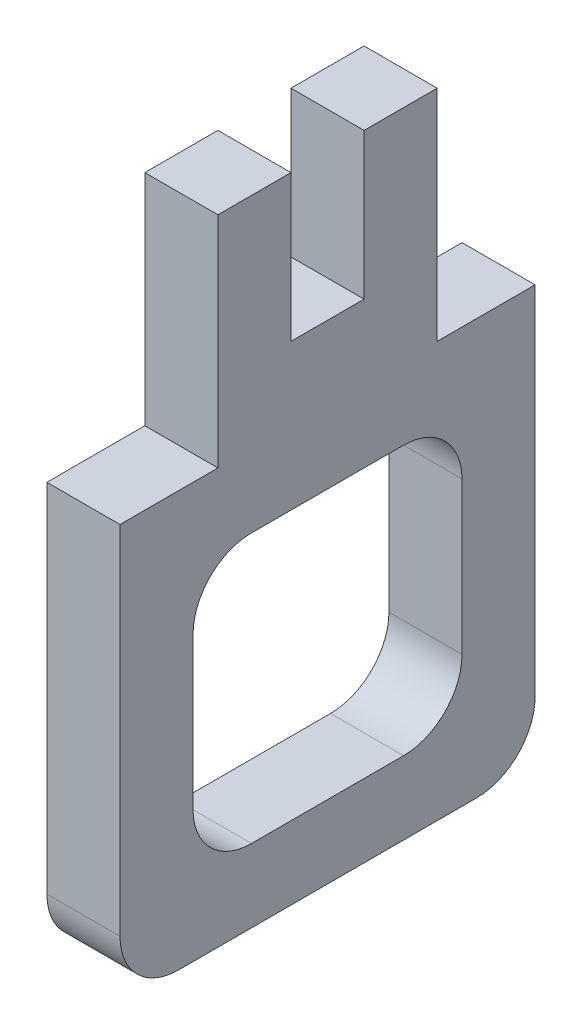
ISO-10303-21;
HEADER;
FILE_DESCRIPTION(('STEP AP214'),'2;1');
FILE_NAME('part.step','',(''),(''),'','','');
FILE_SCHEMA(('AUTOMOTIVE_DESIGN { 1 0 10303 214 1 1 1 1 }'));
ENDSEC;
DATA;
#1=APPLICATION_CONTEXT('core data for automotive mechanical design processes');
#2=APPLICATION_PROTOCOL_DEFINITION('international standard','automotive_design',2000,#1);
#3=PRODUCT_CONTEXT('',#1,'mechanical');
#4=PRODUCT('Part','Part','',(#3));
#5=PRODUCT_RELATED_PRODUCT_CATEGORY('part','',(#4));
#6=PRODUCT_DEFINITION_FORMATION('','',#4);
#7=PRODUCT_DEFINITION_CONTEXT('part definition',#1,'design');
#8=PRODUCT_DEFINITION('design','',#6,#7);
#9=PRODUCT_DEFINITION_SHAPE('','',#8);
#10=(LENGTH_UNIT() NAMED_UNIT(*) SI_UNIT(.MILLI.,.METRE.));
#11=(NAMED_UNIT(*) PLANE_ANGLE_UNIT() SI_UNIT($,.RADIAN.));
#12=(NAMED_UNIT(*) SI_UNIT($,.STERADIAN.) SOLID_ANGLE_UNIT());
#13=UNCERTAINTY_MEASURE_WITH_UNIT(LENGTH_MEASURE(1.E-05),#10,'distance_accuracy_value','');
#14=(GEOMETRIC_REPRESENTATION_CONTEXT(3) GLOBAL_UNCERTAINTY_ASSIGNED_CONTEXT((#13)) GLOBAL_UNIT_ASSIGNED_CONTEXT((#10,
#11,#12)) REPRESENTATION_CONTEXT('',''));
#15=CARTESIAN_POINT('',(0.,0.,0.));
#16=DIRECTION('',(0.,0.,1.));
#17=DIRECTION('',(1.,0.,0.));
#18=AXIS2_PLACEMENT_3D('',#15,#16,#17);
#19=CARTESIAN_POINT('',(6.35,5.08,-5.08));
#20=DIRECTION('',(1.,0.,0.));
#21=DIRECTION('',(0.,0.,-1.));
#22=AXIS2_PLACEMENT_3D('',#19,#20,#21);
#23=PLANE('',#22);
#24=DIRECTION('',(0.,0.,1.));
#25=VECTOR('',#24,1.);
#26=CARTESIAN_POINT('',(6.35,55.118,-14.859));
#27=LINE('',#26,#25);
#28=CARTESIAN_POINT('',(6.35,55.118,-14.859));
#29=VERTEX_POINT('',#28);
#30=CARTESIAN_POINT('',(6.35,55.118,-8.509));
#31=VERTEX_POINT('',#30);
#32=EDGE_CURVE('E252',#29,#31,#27,.T.);
#33=ORIENTED_EDGE('',*,*,#32,.T.);
#34=DIRECTION('',(0.,-1.,0.));
#35=VECTOR('',#34,1.);
#36=CARTESIAN_POINT('',(6.35,55.118,-8.509));
#37=LINE('',#36,#35);
#38=CARTESIAN_POINT('',(6.35,36.068,-8.509));
#39=VERTEX_POINT('',#38);
#40=EDGE_CURVE('E255',#31,#39,#37,.T.);
#41=ORIENTED_EDGE('',*,*,#40,.T.);
#42=DIRECTION('',(0.,0.,1.));
#43=VECTOR('',#42,1.);
#44=CARTESIAN_POINT('',(6.35,36.068,-8.509));
#45=LINE('',#44,#43);
#46=CARTESIAN_POINT('',(6.35,36.068,0.));
#47=VERTEX_POINT('',#46);
#48=EDGE_CURVE('E258',#39,#47,#45,.T.);
#49=ORIENTED_EDGE('',*,*,#48,.T.);
#50=DIRECTION('',(0.,-1.,0.));
#51=VECTOR('',#50,1.);
#52=CARTESIAN_POINT('',(6.35,36.068,0.));
#53=LINE('',#52,#51);
#54=CARTESIAN_POINT('',(6.35,5.08000000000004,0.));
#55=VERTEX_POINT('',#54);
#56=EDGE_CURVE('E260',#47,#55,#53,.T.);
#57=ORIENTED_EDGE('',*,*,#56,.T.);
#58=CARTESIAN_POINT('',(6.35,5.08,-5.08));
#59=DIRECTION('',(1.,0.,0.));
#60=DIRECTION('',(0.,0.,-1.));
#61=AXIS2_PLACEMENT_3D('',#58,#59,#60);
#62=CIRCLE('',#61,5.08);
#63=CARTESIAN_POINT('',(6.35,0.,-5.08000000000004));
#64=VERTEX_POINT('',#63);
#65=EDGE_CURVE('E262',#55,#64,#62,.T.);
#66=ORIENTED_EDGE('',*,*,#65,.T.);
#67=DIRECTION('',(0.,0.,-1.));
#68=VECTOR('',#67,1.);
#69=CARTESIAN_POINT('',(6.35,0.,-30.988));
#70=LINE('',#69,#68);
#71=CARTESIAN_POINT('',(6.35,0.,-30.988));
#72=VERTEX_POINT('',#71);
#73=EDGE_CURVE('E264',#64,#72,#70,.T.);
#74=ORIENTED_EDGE('',*,*,#73,.T.);
#75=CARTESIAN_POINT('',(6.35,5.08,-30.988));
#76=DIRECTION('',(1.,0.,0.));
#77=DIRECTION('',(0.,0.,1.));
#78=AXIS2_PLACEMENT_3D('',#75,#76,#77);
#79=CIRCLE('',#78,5.08);
#80=CARTESIAN_POINT('',(6.35,5.08000000000004,-36.068));
#81=VERTEX_POINT('',#80);
#82=EDGE_CURVE('E266',#72,#81,#79,.T.);
#83=ORIENTED_EDGE('',*,*,#82,.T.);
#84=DIRECTION('',(0.,1.,0.));
#85=VECTOR('',#84,1.);
#86=CARTESIAN_POINT('',(6.35,36.068,-36.068));
#87=LINE('',#86,#85);
#88=CARTESIAN_POINT('',(6.35,36.068,-36.068));
#89=VERTEX_POINT('',#88);
#90=EDGE_CURVE('E268',#81,#89,#87,.T.);
#91=ORIENTED_EDGE('',*,*,#90,.T.);
#92=DIRECTION('',(0.,0.,1.));
#93=VECTOR('',#92,1.);
#94=CARTESIAN_POINT('',(6.35,36.068,-27.559));
#95=LINE('',#94,#93);
#96=CARTESIAN_POINT('',(6.35,36.068,-27.559));
#97=VERTEX_POINT('',#96);
#98=EDGE_CURVE('E270',#89,#97,#95,.T.);
#99=ORIENTED_EDGE('',*,*,#98,.T.);
#100=DIRECTION('',(0.,1.,0.));
#101=VECTOR('',#100,1.);
#102=CARTESIAN_POINT('',(6.35,55.118,-27.559));
#103=LINE('',#102,#101);
#104=CARTESIAN_POINT('',(6.35,55.118,-27.559));
#105=VERTEX_POINT('',#104);
#106=EDGE_CURVE('E272',#97,#105,#103,.T.);
#107=ORIENTED_EDGE('',*,*,#106,.T.);
#108=DIRECTION('',(0.,0.,1.));
#109=VECTOR('',#108,1.);
#110=CARTESIAN_POINT('',(6.35,55.118,-21.209));
#111=LINE('',#110,#109);
#112=CARTESIAN_POINT('',(6.35,55.118,-21.209));
#113=VERTEX_POINT('',#112);
#114=EDGE_CURVE('E274',#105,#113,#111,.T.);
#115=ORIENTED_EDGE('',*,*,#114,.T.);
#116=DIRECTION('',(0.,-1.,0.));
#117=VECTOR('',#116,1.);
#118=CARTESIAN_POINT('',(6.35,42.418,-21.209));
#119=LINE('',#118,#117);
#120=CARTESIAN_POINT('',(6.35,42.418,-21.209));
#121=VERTEX_POINT('',#120);
#122=EDGE_CURVE('E276',#113,#121,#119,.T.);
#123=ORIENTED_EDGE('',*,*,#122,.T.);
#124=DIRECTION('',(0.,0.,1.));
#125=VECTOR('',#124,1.);
#126=CARTESIAN_POINT('',(6.35,42.418,-14.859));
#127=LINE('',#126,#125);
#128=CARTESIAN_POINT('',(6.35,42.418,-14.859));
#129=VERTEX_POINT('',#128);
#130=EDGE_CURVE('E278',#121,#129,#127,.T.);
#131=ORIENTED_EDGE('',*,*,#130,.T.);
#132=DIRECTION('',(0.,1.,0.));
#133=VECTOR('',#132,1.);
#134=CARTESIAN_POINT('',(6.35,55.118,-14.859));
#135=LINE('',#134,#133);
#136=EDGE_CURVE('E280',#129,#29,#135,.T.);
#137=ORIENTED_EDGE('',*,*,#136,.T.);
#138=EDGE_LOOP('',(#33,#41,#49,#57,#66,#74,#83,#91,#99,#107,#115,#123,#131,#137));
#139=FACE_BOUND('',#138,.T.);
#140=DIRECTION('',(0.,0.,-1.));
#141=VECTOR('',#140,1.);
#142=CARTESIAN_POINT('',(6.35,6.35,-11.43));
#143=LINE('',#142,#141);
#144=CARTESIAN_POINT('',(6.35,6.35,-11.43));
#145=VERTEX_POINT('',#144);
#146=CARTESIAN_POINT('',(6.35,6.35,-24.638));
#147=VERTEX_POINT('',#146);
#148=EDGE_CURVE('E195',#145,#147,#143,.T.);
#149=ORIENTED_EDGE('',*,*,#148,.F.);
#150=CARTESIAN_POINT('',(6.35,11.43,-11.43));
#151=DIRECTION('',(1.,0.,0.));
#152=DIRECTION('',(0.,0.,1.));
#153=AXIS2_PLACEMENT_3D('',#150,#151,#152);
#154=CIRCLE('',#153,5.08);
#155=CARTESIAN_POINT('',(6.35,11.43,-6.35));
#156=VERTEX_POINT('',#155);
#157=EDGE_CURVE('E187',#156,#145,#154,.T.);
#158=ORIENTED_EDGE('',*,*,#157,.F.);
#159=DIRECTION('',(0.,-1.,0.));
#160=VECTOR('',#159,1.);
#161=CARTESIAN_POINT('',(6.35,11.43,-6.35));
#162=LINE('',#161,#160);
#163=CARTESIAN_POINT('',(6.35,24.638,-6.35));
#164=VERTEX_POINT('',#163);
#165=EDGE_CURVE('E220',#164,#156,#162,.T.);
#166=ORIENTED_EDGE('',*,*,#165,.F.);
#167=CARTESIAN_POINT('',(6.35,24.638,-11.43));
#168=DIRECTION('',(1.,0.,0.));
#169=DIRECTION('',(0.,0.,1.));
#170=AXIS2_PLACEMENT_3D('',#167,#168,#169);
#171=CIRCLE('',#170,5.08);
#172=CARTESIAN_POINT('',(6.35,29.718,-11.43));
#173=VERTEX_POINT('',#172);
#174=EDGE_CURVE('E218',#173,#164,#171,.T.);
#175=ORIENTED_EDGE('',*,*,#174,.F.);
#176=DIRECTION('',(0.,0.,1.));
#177=VECTOR('',#176,1.);
#178=CARTESIAN_POINT('',(6.35,29.718,-11.43));
#179=LINE('',#178,#177);
#180=CARTESIAN_POINT('',(6.35,29.718,-24.638));
#181=VERTEX_POINT('',#180);
#182=EDGE_CURVE('E216',#181,#173,#179,.T.);
#183=ORIENTED_EDGE('',*,*,#182,.F.);
#184=CARTESIAN_POINT('',(6.35,24.638,-24.638));
#185=DIRECTION('',(1.,0.,0.));
#186=DIRECTION('',(0.,0.,1.));
#187=AXIS2_PLACEMENT_3D('',#184,#185,#186);
#188=CIRCLE('',#187,5.08);
#189=CARTESIAN_POINT('',(6.35,24.638,-29.718));
#190=VERTEX_POINT('',#189);
#191=EDGE_CURVE('E214',#190,#181,#188,.T.);
#192=ORIENTED_EDGE('',*,*,#191,.F.);
#193=DIRECTION('',(0.,1.,0.));
#194=VECTOR('',#193,1.);
#195=CARTESIAN_POINT('',(6.35,11.43,-29.718));
#196=LINE('',#195,#194);
#197=CARTESIAN_POINT('',(6.35,11.43,-29.718));
#198=VERTEX_POINT('',#197);
#199=EDGE_CURVE('E210',#198,#190,#196,.T.);
#200=ORIENTED_EDGE('',*,*,#199,.F.);
#201=CARTESIAN_POINT('',(6.35,11.43,-24.638));
#202=DIRECTION('',(1.,0.,0.));
#203=DIRECTION('',(0.,0.,-1.));
#204=AXIS2_PLACEMENT_3D('',#201,#202,#203);
#205=CIRCLE('',#204,5.08);
#206=EDGE_CURVE('E208',#147,#198,#205,.T.);
#207=ORIENTED_EDGE('',*,*,#206,.F.);
#208=EDGE_LOOP('',(#149,#158,#166,#175,#183,#192,#200,#207));
#209=FACE_BOUND('',#208,.T.);
#210=ADVANCED_FACE('F38',(#139,#209),#23,.T.);
#211=CARTESIAN_POINT('',(0.,5.08,-5.08));
#212=DIRECTION('',(1.,0.,0.));
#213=DIRECTION('',(0.,0.,-1.));
#214=AXIS2_PLACEMENT_3D('',#211,#212,#213);
#215=PLANE('',#214);
#216=DIRECTION('',(0.,0.,1.));
#217=VECTOR('',#216,1.);
#218=CARTESIAN_POINT('',(0.,55.118,-14.859));
#219=LINE('',#218,#217);
#220=CARTESIAN_POINT('',(0.,55.118,-14.859));
#221=VERTEX_POINT('',#220);
#222=CARTESIAN_POINT('',(0.,55.118,-8.509));
#223=VERTEX_POINT('',#222);
#224=EDGE_CURVE('E203',#221,#223,#219,.T.);
#225=ORIENTED_EDGE('',*,*,#224,.F.);
#226=DIRECTION('',(0.,1.,0.));
#227=VECTOR('',#226,1.);
#228=CARTESIAN_POINT('',(0.,55.118,-14.859));
#229=LINE('',#228,#227);
#230=CARTESIAN_POINT('',(0.,42.418,-14.859));
#231=VERTEX_POINT('',#230);
#232=EDGE_CURVE('E256',#231,#221,#229,.T.);
#233=ORIENTED_EDGE('',*,*,#232,.F.);
#234=DIRECTION('',(0.,0.,1.));
#235=VECTOR('',#234,1.);
#236=CARTESIAN_POINT('',(0.,42.418,-14.859));
#237=LINE('',#236,#235);
#238=CARTESIAN_POINT('',(0.,42.418,-21.209));
#239=VERTEX_POINT('',#238);
#240=EDGE_CURVE('E307',#239,#231,#237,.T.);
#241=ORIENTED_EDGE('',*,*,#240,.F.);
#242=DIRECTION('',(0.,-1.,0.));
#243=VECTOR('',#242,1.);
#244=CARTESIAN_POINT('',(0.,42.418,-21.209));
#245=LINE('',#244,#243);
#246=CARTESIAN_POINT('',(0.,55.118,-21.209));
#247=VERTEX_POINT('',#246);
#248=EDGE_CURVE('E305',#247,#239,#245,.T.);
#249=ORIENTED_EDGE('',*,*,#248,.F.);
#250=DIRECTION('',(0.,0.,1.));
#251=VECTOR('',#250,1.);
#252=CARTESIAN_POINT('',(0.,55.118,-21.209));
#253=LINE('',#252,#251);
#254=CARTESIAN_POINT('',(0.,55.118,-27.559));
#255=VERTEX_POINT('',#254);
#256=EDGE_CURVE('E303',#255,#247,#253,.T.);
#257=ORIENTED_EDGE('',*,*,#256,.F.);
#258=DIRECTION('',(0.,1.,0.));
#259=VECTOR('',#258,1.);
#260=CARTESIAN_POINT('',(0.,55.118,-27.559));
#261=LINE('',#260,#259);
#262=CARTESIAN_POINT('',(0.,36.068,-27.559));
#263=VERTEX_POINT('',#262);
#264=EDGE_CURVE('E301',#263,#255,#261,.T.);
#265=ORIENTED_EDGE('',*,*,#264,.F.);
#266=DIRECTION('',(0.,0.,1.));
#267=VECTOR('',#266,1.);
#268=CARTESIAN_POINT('',(0.,36.068,-27.559));
#269=LINE('',#268,#267);
#270=CARTESIAN_POINT('',(0.,36.068,-36.068));
#271=VERTEX_POINT('',#270);
#272=EDGE_CURVE('E299',#271,#263,#269,.T.);
#273=ORIENTED_EDGE('',*,*,#272,.F.);
#274=DIRECTION('',(0.,1.,0.));
#275=VECTOR('',#274,1.);
#276=CARTESIAN_POINT('',(0.,36.068,-36.068));
#277=LINE('',#276,#275);
#278=CARTESIAN_POINT('',(0.,5.08000000000004,-36.068));
#279=VERTEX_POINT('',#278);
#280=EDGE_CURVE('E297',#279,#271,#277,.T.);
#281=ORIENTED_EDGE('',*,*,#280,.F.);
#282=CARTESIAN_POINT('',(0.,5.08,-30.988));
#283=DIRECTION('',(1.,0.,0.));
#284=DIRECTION('',(0.,0.,1.));
#285=AXIS2_PLACEMENT_3D('',#282,#283,#284);
#286=CIRCLE('',#285,5.08);
#287=CARTESIAN_POINT('',(0.,0.,-30.988));
#288=VERTEX_POINT('',#287);
#289=EDGE_CURVE('E295',#288,#279,#286,.T.);
#290=ORIENTED_EDGE('',*,*,#289,.F.);
#291=DIRECTION('',(0.,0.,-1.));
#292=VECTOR('',#291,1.);
#293=CARTESIAN_POINT('',(0.,0.,-30.988));
#294=LINE('',#293,#292);
#295=CARTESIAN_POINT('',(0.,0.,-5.08000000000004));
#296=VERTEX_POINT('',#295);
#297=EDGE_CURVE('E293',#296,#288,#294,.T.);
#298=ORIENTED_EDGE('',*,*,#297,.F.);
#299=CARTESIAN_POINT('',(0.,5.08,-5.08));
#300=DIRECTION('',(1.,0.,0.));
#301=DIRECTION('',(0.,0.,-1.));
#302=AXIS2_PLACEMENT_3D('',#299,#300,#301);
#303=CIRCLE('',#302,5.08);
#304=CARTESIAN_POINT('',(0.,5.08000000000004,0.));
#305=VERTEX_POINT('',#304);
#306=EDGE_CURVE('E291',#305,#296,#303,.T.);
#307=ORIENTED_EDGE('',*,*,#306,.F.);
#308=DIRECTION('',(0.,-1.,0.));
#309=VECTOR('',#308,1.);
#310=CARTESIAN_POINT('',(0.,36.068,0.));
#311=LINE('',#310,#309);
#312=CARTESIAN_POINT('',(0.,36.068,0.));
#313=VERTEX_POINT('',#312);
#314=EDGE_CURVE('E289',#313,#305,#311,.T.);
#315=ORIENTED_EDGE('',*,*,#314,.F.);
#316=DIRECTION('',(0.,0.,1.));
#317=VECTOR('',#316,1.);
#318=CARTESIAN_POINT('',(0.,36.068,-8.509));
#319=LINE('',#318,#317);
#320=CARTESIAN_POINT('',(0.,36.068,-8.509));
#321=VERTEX_POINT('',#320);
#322=EDGE_CURVE('E287',#321,#313,#319,.T.);
#323=ORIENTED_EDGE('',*,*,#322,.F.);
#324=DIRECTION('',(0.,-1.,0.));
#325=VECTOR('',#324,1.);
#326=CARTESIAN_POINT('',(0.,55.118,-8.509));
#327=LINE('',#326,#325);
#328=EDGE_CURVE('E285',#223,#321,#327,.T.);
#329=ORIENTED_EDGE('',*,*,#328,.F.);
#330=EDGE_LOOP('',(#225,#233,#241,#249,#257,#265,#273,#281,#290,#298,#307,#315,#323,#329));
#331=FACE_BOUND('',#330,.T.);
#332=CARTESIAN_POINT('',(0.,11.43,-11.43));
#333=DIRECTION('',(1.,0.,0.));
#334=DIRECTION('',(0.,0.,1.));
#335=AXIS2_PLACEMENT_3D('',#332,#333,#334);
#336=CIRCLE('',#335,5.08);
#337=CARTESIAN_POINT('',(0.,11.43,-6.35));
#338=VERTEX_POINT('',#337);
#339=CARTESIAN_POINT('',(0.,6.35,-11.43));
#340=VERTEX_POINT('',#339);
#341=EDGE_CURVE('E61',#338,#340,#336,.T.);
#342=ORIENTED_EDGE('',*,*,#341,.T.);
#343=DIRECTION('',(0.,0.,-1.));
#344=VECTOR('',#343,1.);
#345=CARTESIAN_POINT('',(0.,6.35,-11.43));
#346=LINE('',#345,#344);
#347=CARTESIAN_POINT('',(0.,6.35,-24.638));
#348=VERTEX_POINT('',#347);
#349=EDGE_CURVE('E202',#340,#348,#346,.T.);
#350=ORIENTED_EDGE('',*,*,#349,.T.);
#351=CARTESIAN_POINT('',(0.,11.43,-24.638));
#352=DIRECTION('',(1.,0.,0.));
#353=DIRECTION('',(0.,0.,-1.));
#354=AXIS2_PLACEMENT_3D('',#351,#352,#353);
#355=CIRCLE('',#354,5.08);
#356=CARTESIAN_POINT('',(0.,11.43,-29.718));
#357=VERTEX_POINT('',#356);
#358=EDGE_CURVE('E224',#348,#357,#355,.T.);
#359=ORIENTED_EDGE('',*,*,#358,.T.);
#360=DIRECTION('',(0.,1.,0.));
#361=VECTOR('',#360,1.);
#362=CARTESIAN_POINT('',(0.,11.43,-29.718));
#363=LINE('',#362,#361);
#364=CARTESIAN_POINT('',(0.,24.638,-29.718));
#365=VERTEX_POINT('',#364);
#366=EDGE_CURVE('E227',#357,#365,#363,.T.);
#367=ORIENTED_EDGE('',*,*,#366,.T.);
#368=CARTESIAN_POINT('',(0.,24.638,-24.638));
#369=DIRECTION('',(1.,0.,0.));
#370=DIRECTION('',(0.,0.,1.));
#371=AXIS2_PLACEMENT_3D('',#368,#369,#370);
#372=CIRCLE('',#371,5.08);
#373=CARTESIAN_POINT('',(0.,29.718,-24.638));
#374=VERTEX_POINT('',#373);
#375=EDGE_CURVE('E230',#365,#374,#372,.T.);
#376=ORIENTED_EDGE('',*,*,#375,.T.);
#377=DIRECTION('',(0.,0.,1.));
#378=VECTOR('',#377,1.);
#379=CARTESIAN_POINT('',(0.,29.718,-11.43));
#380=LINE('',#379,#378);
#381=CARTESIAN_POINT('',(0.,29.718,-11.43));
#382=VERTEX_POINT('',#381);
#383=EDGE_CURVE('E233',#374,#382,#380,.T.);
#384=ORIENTED_EDGE('',*,*,#383,.T.);
#385=CARTESIAN_POINT('',(0.,24.638,-11.43));
#386=DIRECTION('',(1.,0.,0.));
#387=DIRECTION('',(0.,0.,1.));
#388=AXIS2_PLACEMENT_3D('',#385,#386,#387);
#389=CIRCLE('',#388,5.08);
#390=CARTESIAN_POINT('',(0.,24.638,-6.35));
#391=VERTEX_POINT('',#390);
#392=EDGE_CURVE('E236',#382,#391,#389,.T.);
#393=ORIENTED_EDGE('',*,*,#392,.T.);
#394=DIRECTION('',(0.,-1.,0.));
#395=VECTOR('',#394,1.);
#396=CARTESIAN_POINT('',(0.,11.43,-6.35));
#397=LINE('',#396,#395);
#398=EDGE_CURVE('E196',#391,#338,#397,.T.);
#399=ORIENTED_EDGE('',*,*,#398,.T.);
#400=EDGE_LOOP('',(#342,#350,#359,#367,#376,#384,#393,#399));
#401=FACE_BOUND('',#400,.T.);
#402=ADVANCED_FACE('F355',(#331,#401),#215,.F.);
#403=CARTESIAN_POINT('',(6.35,55.118,-14.859));
#404=DIRECTION('',(0.,-1.,0.));
#405=DIRECTION('',(0.,0.,-1.));
#406=AXIS2_PLACEMENT_3D('',#403,#404,#405);
#407=PLANE('',#406);
#408=ORIENTED_EDGE('',*,*,#224,.T.);
#409=DIRECTION('',(-1.,0.,0.));
#410=VECTOR('',#409,1.);
#411=CARTESIAN_POINT('',(6.35,55.118,-8.509));
#412=LINE('',#411,#410);
#413=EDGE_CURVE('E11',#31,#223,#412,.T.);
#414=ORIENTED_EDGE('',*,*,#413,.F.);
#415=ORIENTED_EDGE('',*,*,#32,.F.);
#416=DIRECTION('',(-1.,0.,0.));
#417=VECTOR('',#416,1.);
#418=CARTESIAN_POINT('',(6.35,55.118,-14.859));
#419=LINE('',#418,#417);
#420=EDGE_CURVE('E282',#29,#221,#419,.T.);
#421=ORIENTED_EDGE('',*,*,#420,.T.);
#422=EDGE_LOOP('',(#408,#414,#415,#421));
#423=FACE_BOUND('',#422,.T.);
#424=ADVANCED_FACE('F40',(#423),#407,.F.);
#425=CARTESIAN_POINT('',(6.35,55.118,-8.509));
#426=DIRECTION('',(0.,0.,-1.));
#427=DIRECTION('',(0.,1.,0.));
#428=AXIS2_PLACEMENT_3D('',#425,#426,#427);
#429=PLANE('',#428);
#430=ORIENTED_EDGE('',*,*,#328,.T.);
#431=DIRECTION('',(-1.,0.,0.));
#432=VECTOR('',#431,1.);
#433=CARTESIAN_POINT('',(6.35,36.068,-8.509));
#434=LINE('',#433,#432);
#435=EDGE_CURVE('E46',#39,#321,#434,.T.);
#436=ORIENTED_EDGE('',*,*,#435,.F.);
#437=ORIENTED_EDGE('',*,*,#40,.F.);
#438=ORIENTED_EDGE('',*,*,#413,.T.);
#439=EDGE_LOOP('',(#430,#436,#437,#438));
#440=FACE_BOUND('',#439,.T.);
#441=ADVANCED_FACE('F372',(#440),#429,.F.);
#442=CARTESIAN_POINT('',(6.35,36.068,-8.509));
#443=DIRECTION('',(0.,-1.,0.));
#444=DIRECTION('',(0.,0.,-1.));
#445=AXIS2_PLACEMENT_3D('',#442,#443,#444);
#446=PLANE('',#445);
#447=ORIENTED_EDGE('',*,*,#322,.T.);
#448=DIRECTION('',(-1.,0.,0.));
#449=VECTOR('',#448,1.);
#450=CARTESIAN_POINT('',(6.35,36.068,0.));
#451=LINE('',#450,#449);
#452=EDGE_CURVE('E342',#47,#313,#451,.T.);
#453=ORIENTED_EDGE('',*,*,#452,.F.);
#454=ORIENTED_EDGE('',*,*,#48,.F.);
#455=ORIENTED_EDGE('',*,*,#435,.T.);
#456=EDGE_LOOP('',(#447,#453,#454,#455));
#457=FACE_BOUND('',#456,.T.);
#458=ADVANCED_FACE('F349',(#457),#446,.F.);
#459=CARTESIAN_POINT('',(6.35,36.068,0.));
#460=DIRECTION('',(0.,0.,-1.));
#461=DIRECTION('',(0.,1.,0.));
#462=AXIS2_PLACEMENT_3D('',#459,#460,#461);
#463=PLANE('',#462);
#464=ORIENTED_EDGE('',*,*,#314,.T.);
#465=DIRECTION('',(-1.,0.,0.));
#466=VECTOR('',#465,1.);
#467=CARTESIAN_POINT('',(6.35,5.08000000000004,0.));
#468=LINE('',#467,#466);
#469=EDGE_CURVE('E339',#55,#305,#468,.T.);
#470=ORIENTED_EDGE('',*,*,#469,.F.);
#471=ORIENTED_EDGE('',*,*,#56,.F.);
#472=ORIENTED_EDGE('',*,*,#452,.T.);
#473=EDGE_LOOP('',(#464,#470,#471,#472));
#474=FACE_BOUND('',#473,.T.);
#475=ADVANCED_FACE('F361',(#474),#463,.F.);
#476=CARTESIAN_POINT('',(6.35,5.08,-5.08));
#477=DIRECTION('',(-1.,0.,0.));
#478=DIRECTION('',(0.,0.,1.));
#479=AXIS2_PLACEMENT_3D('',#476,#477,#478);
#480=CYLINDRICAL_SURFACE('',#479,5.08);
#481=ORIENTED_EDGE('',*,*,#306,.T.);
#482=DIRECTION('',(-1.,0.,0.));
#483=VECTOR('',#482,1.);
#484=CARTESIAN_POINT('',(6.35,0.,-5.08000000000004));
#485=LINE('',#484,#483);
#486=EDGE_CURVE('E336',#64,#296,#485,.T.);
#487=ORIENTED_EDGE('',*,*,#486,.F.);
#488=ORIENTED_EDGE('',*,*,#65,.F.);
#489=ORIENTED_EDGE('',*,*,#469,.T.);
#490=EDGE_LOOP('',(#481,#487,#488,#489));
#491=FACE_BOUND('',#490,.T.);
#492=ADVANCED_FACE('F365',(#491),#480,.T.);
#493=CARTESIAN_POINT('',(6.35,0.,-30.988));
#494=DIRECTION('',(0.,1.,0.));
#495=DIRECTION('',(0.,0.,1.));
#496=AXIS2_PLACEMENT_3D('',#493,#494,#495);
#497=PLANE('',#496);
#498=ORIENTED_EDGE('',*,*,#297,.T.);
#499=DIRECTION('',(-1.,0.,0.));
#500=VECTOR('',#499,1.);
#501=CARTESIAN_POINT('',(6.35,0.,-30.988));
#502=LINE('',#501,#500);
#503=EDGE_CURVE('E333',#72,#288,#502,.T.);
#504=ORIENTED_EDGE('',*,*,#503,.F.);
#505=ORIENTED_EDGE('',*,*,#73,.F.);
#506=ORIENTED_EDGE('',*,*,#486,.T.);
#507=EDGE_LOOP('',(#498,#504,#505,#506));
#508=FACE_BOUND('',#507,.T.);
#509=ADVANCED_FACE('F415',(#508),#497,.F.);
#510=CARTESIAN_POINT('',(6.35,5.08,-30.988));
#511=DIRECTION('',(-1.,0.,0.));
#512=DIRECTION('',(0.,0.,1.));
#513=AXIS2_PLACEMENT_3D('',#510,#511,#512);
#514=CYLINDRICAL_SURFACE('',#513,5.08);
#515=ORIENTED_EDGE('',*,*,#289,.T.);
#516=DIRECTION('',(-1.,0.,0.));
#517=VECTOR('',#516,1.);
#518=CARTESIAN_POINT('',(6.35,5.08000000000004,-36.068));
#519=LINE('',#518,#517);
#520=EDGE_CURVE('E330',#81,#279,#519,.T.);
#521=ORIENTED_EDGE('',*,*,#520,.F.);
#522=ORIENTED_EDGE('',*,*,#82,.F.);
#523=ORIENTED_EDGE('',*,*,#503,.T.);
#524=EDGE_LOOP('',(#515,#521,#522,#523));
#525=FACE_BOUND('',#524,.T.);
#526=ADVANCED_FACE('F413',(#525),#514,.T.);
#527=CARTESIAN_POINT('',(6.35,36.068,-36.068));
#528=DIRECTION('',(0.,0.,1.));
#529=DIRECTION('',(1.,0.,0.));
#530=AXIS2_PLACEMENT_3D('',#527,#528,#529);
#531=PLANE('',#530);
#532=ORIENTED_EDGE('',*,*,#280,.T.);
#533=DIRECTION('',(-1.,0.,0.));
#534=VECTOR('',#533,1.);
#535=CARTESIAN_POINT('',(6.35,36.068,-36.068));
#536=LINE('',#535,#534);
#537=EDGE_CURVE('E327',#89,#271,#536,.T.);
#538=ORIENTED_EDGE('',*,*,#537,.F.);
#539=ORIENTED_EDGE('',*,*,#90,.F.);
#540=ORIENTED_EDGE('',*,*,#520,.T.);
#541=EDGE_LOOP('',(#532,#538,#539,#540));
#542=FACE_BOUND('',#541,.T.);
#543=ADVANCED_FACE('F408',(#542),#531,.F.);
#544=CARTESIAN_POINT('',(6.35,36.068,-27.559));
#545=DIRECTION('',(0.,-1.,0.));
#546=DIRECTION('',(0.,0.,-1.));
#547=AXIS2_PLACEMENT_3D('',#544,#545,#546);
#548=PLANE('',#547);
#549=ORIENTED_EDGE('',*,*,#272,.T.);
#550=DIRECTION('',(-1.,0.,0.));
#551=VECTOR('',#550,1.);
#552=CARTESIAN_POINT('',(6.35,36.068,-27.559));
#553=LINE('',#552,#551);
#554=EDGE_CURVE('E324',#97,#263,#553,.T.);
#555=ORIENTED_EDGE('',*,*,#554,.F.);
#556=ORIENTED_EDGE('',*,*,#98,.F.);
#557=ORIENTED_EDGE('',*,*,#537,.T.);
#558=EDGE_LOOP('',(#549,#555,#556,#557));
#559=FACE_BOUND('',#558,.T.);
#560=ADVANCED_FACE('F403',(#559),#548,.F.);
#561=CARTESIAN_POINT('',(6.35,55.118,-27.559));
#562=DIRECTION('',(0.,0.,1.));
#563=DIRECTION('',(1.,0.,0.));
#564=AXIS2_PLACEMENT_3D('',#561,#562,#563);
#565=PLANE('',#564);
#566=ORIENTED_EDGE('',*,*,#264,.T.);
#567=DIRECTION('',(-1.,0.,0.));
#568=VECTOR('',#567,1.);
#569=CARTESIAN_POINT('',(6.35,55.118,-27.559));
#570=LINE('',#569,#568);
#571=EDGE_CURVE('E321',#105,#255,#570,.T.);
#572=ORIENTED_EDGE('',*,*,#571,.F.);
#573=ORIENTED_EDGE('',*,*,#106,.F.);
#574=ORIENTED_EDGE('',*,*,#554,.T.);
#575=EDGE_LOOP('',(#566,#572,#573,#574));
#576=FACE_BOUND('',#575,.T.);
#577=ADVANCED_FACE('F399',(#576),#565,.F.);
#578=CARTESIAN_POINT('',(6.35,55.118,-21.209));
#579=DIRECTION('',(0.,-1.,0.));
#580=DIRECTION('',(0.,0.,-1.));
#581=AXIS2_PLACEMENT_3D('',#578,#579,#580);
#582=PLANE('',#581);
#583=ORIENTED_EDGE('',*,*,#256,.T.);
#584=DIRECTION('',(-1.,0.,0.));
#585=VECTOR('',#584,1.);
#586=CARTESIAN_POINT('',(6.35,55.118,-21.209));
#587=LINE('',#586,#585);
#588=EDGE_CURVE('E318',#113,#247,#587,.T.);
#589=ORIENTED_EDGE('',*,*,#588,.F.);
#590=ORIENTED_EDGE('',*,*,#114,.F.);
#591=ORIENTED_EDGE('',*,*,#571,.T.);
#592=EDGE_LOOP('',(#583,#589,#590,#591));
#593=FACE_BOUND('',#592,.T.);
#594=ADVANCED_FACE('F394',(#593),#582,.F.);
#595=CARTESIAN_POINT('',(6.35,42.418,-21.209));
#596=DIRECTION('',(0.,0.,-1.));
#597=DIRECTION('',(0.,1.,0.));
#598=AXIS2_PLACEMENT_3D('',#595,#596,#597);
#599=PLANE('',#598);
#600=ORIENTED_EDGE('',*,*,#248,.T.);
#601=DIRECTION('',(-1.,0.,0.));
#602=VECTOR('',#601,1.);
#603=CARTESIAN_POINT('',(6.35,42.418,-21.209));
#604=LINE('',#603,#602);
#605=EDGE_CURVE('E315',#121,#239,#604,.T.);
#606=ORIENTED_EDGE('',*,*,#605,.F.);
#607=ORIENTED_EDGE('',*,*,#122,.F.);
#608=ORIENTED_EDGE('',*,*,#588,.T.);
#609=EDGE_LOOP('',(#600,#606,#607,#608));
#610=FACE_BOUND('',#609,.T.);
#611=ADVANCED_FACE('F388',(#610),#599,.F.);
#612=CARTESIAN_POINT('',(6.35,42.418,-14.859));
#613=DIRECTION('',(0.,-1.,0.));
#614=DIRECTION('',(0.,0.,-1.));
#615=AXIS2_PLACEMENT_3D('',#612,#613,#614);
#616=PLANE('',#615);
#617=ORIENTED_EDGE('',*,*,#240,.T.);
#618=DIRECTION('',(-1.,0.,0.));
#619=VECTOR('',#618,1.);
#620=CARTESIAN_POINT('',(6.35,42.418,-14.859));
#621=LINE('',#620,#619);
#622=EDGE_CURVE('E312',#129,#231,#621,.T.);
#623=ORIENTED_EDGE('',*,*,#622,.F.);
#624=ORIENTED_EDGE('',*,*,#130,.F.);
#625=ORIENTED_EDGE('',*,*,#605,.T.);
#626=EDGE_LOOP('',(#617,#623,#624,#625));
#627=FACE_BOUND('',#626,.T.);
#628=ADVANCED_FACE('F384',(#627),#616,.F.);
#629=CARTESIAN_POINT('',(6.35,55.118,-14.859));
#630=DIRECTION('',(0.,0.,1.));
#631=DIRECTION('',(0.,-1.,0.));
#632=AXIS2_PLACEMENT_3D('',#629,#630,#631);
#633=PLANE('',#632);
#634=ORIENTED_EDGE('',*,*,#232,.T.);
#635=ORIENTED_EDGE('',*,*,#420,.F.);
#636=ORIENTED_EDGE('',*,*,#136,.F.);
#637=ORIENTED_EDGE('',*,*,#622,.T.);
#638=EDGE_LOOP('',(#634,#635,#636,#637));
#639=FACE_BOUND('',#638,.T.);
#640=ADVANCED_FACE('F379',(#639),#633,.F.);
#641=CARTESIAN_POINT('',(6.35,11.43,-11.43));
#642=DIRECTION('',(-1.,0.,0.));
#643=DIRECTION('',(0.,0.,1.));
#644=AXIS2_PLACEMENT_3D('',#641,#642,#643);
#645=CYLINDRICAL_SURFACE('',#644,5.08);
#646=ORIENTED_EDGE('',*,*,#341,.F.);
#647=DIRECTION('',(-1.,0.,0.));
#648=VECTOR('',#647,1.);
#649=CARTESIAN_POINT('',(6.35,11.43,-6.35));
#650=LINE('',#649,#648);
#651=EDGE_CURVE('E191',#156,#338,#650,.T.);
#652=ORIENTED_EDGE('',*,*,#651,.F.);
#653=ORIENTED_EDGE('',*,*,#157,.T.);
#654=DIRECTION('',(-1.,0.,0.));
#655=VECTOR('',#654,1.);
#656=CARTESIAN_POINT('',(6.35,6.35,-11.43));
#657=LINE('',#656,#655);
#658=EDGE_CURVE('E190',#145,#340,#657,.T.);
#659=ORIENTED_EDGE('',*,*,#658,.T.);
#660=EDGE_LOOP('',(#646,#652,#653,#659));
#661=FACE_BOUND('',#660,.T.);
#662=ADVANCED_FACE('F189',(#661),#645,.F.);
#663=CARTESIAN_POINT('',(6.35,6.35,-11.43));
#664=DIRECTION('',(0.,1.,0.));
#665=DIRECTION('',(0.,0.,1.));
#666=AXIS2_PLACEMENT_3D('',#663,#664,#665);
#667=PLANE('',#666);
#668=ORIENTED_EDGE('',*,*,#349,.F.);
#669=ORIENTED_EDGE('',*,*,#658,.F.);
#670=ORIENTED_EDGE('',*,*,#148,.T.);
#671=DIRECTION('',(-1.,0.,0.));
#672=VECTOR('',#671,1.);
#673=CARTESIAN_POINT('',(6.35,6.35,-24.638));
#674=LINE('',#673,#672);
#675=EDGE_CURVE('E204',#147,#348,#674,.T.);
#676=ORIENTED_EDGE('',*,*,#675,.T.);
#677=EDGE_LOOP('',(#668,#669,#670,#676));
#678=FACE_BOUND('',#677,.T.);
#679=ADVANCED_FACE('F199',(#678),#667,.T.);
#680=CARTESIAN_POINT('',(6.35,11.43,-24.638));
#681=DIRECTION('',(-1.,0.,0.));
#682=DIRECTION('',(0.,0.,1.));
#683=AXIS2_PLACEMENT_3D('',#680,#681,#682);
#684=CYLINDRICAL_SURFACE('',#683,5.08);
#685=ORIENTED_EDGE('',*,*,#358,.F.);
#686=ORIENTED_EDGE('',*,*,#675,.F.);
#687=ORIENTED_EDGE('',*,*,#206,.T.);
#688=DIRECTION('',(-1.,0.,0.));
#689=VECTOR('',#688,1.);
#690=CARTESIAN_POINT('',(6.35,11.43,-29.718));
#691=LINE('',#690,#689);
#692=EDGE_CURVE('E249',#198,#357,#691,.T.);
#693=ORIENTED_EDGE('',*,*,#692,.T.);
#694=EDGE_LOOP('',(#685,#686,#687,#693));
#695=FACE_BOUND('',#694,.T.);
#696=ADVANCED_FACE('F485',(#695),#684,.F.);
#697=CARTESIAN_POINT('',(6.35,11.43,-29.718));
#698=DIRECTION('',(0.,0.,1.));
#699=DIRECTION('',(1.,0.,0.));
#700=AXIS2_PLACEMENT_3D('',#697,#698,#699);
#701=PLANE('',#700);
#702=ORIENTED_EDGE('',*,*,#366,.F.);
#703=ORIENTED_EDGE('',*,*,#692,.F.);
#704=ORIENTED_EDGE('',*,*,#199,.T.);
#705=DIRECTION('',(-1.,0.,0.));
#706=VECTOR('',#705,1.);
#707=CARTESIAN_POINT('',(6.35,24.638,-29.718));
#708=LINE('',#707,#706);
#709=EDGE_CURVE('E247',#190,#365,#708,.T.);
#710=ORIENTED_EDGE('',*,*,#709,.T.);
#711=EDGE_LOOP('',(#702,#703,#704,#710));
#712=FACE_BOUND('',#711,.T.);
#713=ADVANCED_FACE('F491',(#712),#701,.T.);
#714=CARTESIAN_POINT('',(6.35,24.638,-24.638));
#715=DIRECTION('',(-1.,0.,0.));
#716=DIRECTION('',(0.,0.,1.));
#717=AXIS2_PLACEMENT_3D('',#714,#715,#716);
#718=CYLINDRICAL_SURFACE('',#717,5.08);
#719=ORIENTED_EDGE('',*,*,#375,.F.);
#720=ORIENTED_EDGE('',*,*,#709,.F.);
#721=ORIENTED_EDGE('',*,*,#191,.T.);
#722=DIRECTION('',(-1.,0.,0.));
#723=VECTOR('',#722,1.);
#724=CARTESIAN_POINT('',(6.35,29.718,-24.638));
#725=LINE('',#724,#723);
#726=EDGE_CURVE('E245',#181,#374,#725,.T.);
#727=ORIENTED_EDGE('',*,*,#726,.T.);
#728=EDGE_LOOP('',(#719,#720,#721,#727));
#729=FACE_BOUND('',#728,.T.);
#730=ADVANCED_FACE('F499',(#729),#718,.F.);
#731=CARTESIAN_POINT('',(6.35,29.718,-11.43));
#732=DIRECTION('',(0.,-1.,0.));
#733=DIRECTION('',(0.,0.,-1.));
#734=AXIS2_PLACEMENT_3D('',#731,#732,#733);
#735=PLANE('',#734);
#736=ORIENTED_EDGE('',*,*,#383,.F.);
#737=ORIENTED_EDGE('',*,*,#726,.F.);
#738=ORIENTED_EDGE('',*,*,#182,.T.);
#739=DIRECTION('',(-1.,0.,0.));
#740=VECTOR('',#739,1.);
#741=CARTESIAN_POINT('',(6.35,29.718,-11.43));
#742=LINE('',#741,#740);
#743=EDGE_CURVE('E243',#173,#382,#742,.T.);
#744=ORIENTED_EDGE('',*,*,#743,.T.);
#745=EDGE_LOOP('',(#736,#737,#738,#744));
#746=FACE_BOUND('',#745,.T.);
#747=ADVANCED_FACE('F507',(#746),#735,.T.);
#748=CARTESIAN_POINT('',(6.35,24.638,-11.43));
#749=DIRECTION('',(-1.,0.,0.));
#750=DIRECTION('',(0.,0.,1.));
#751=AXIS2_PLACEMENT_3D('',#748,#749,#750);
#752=CYLINDRICAL_SURFACE('',#751,5.08);
#753=ORIENTED_EDGE('',*,*,#392,.F.);
#754=ORIENTED_EDGE('',*,*,#743,.F.);
#755=ORIENTED_EDGE('',*,*,#174,.T.);
#756=DIRECTION('',(-1.,0.,0.));
#757=VECTOR('',#756,1.);
#758=CARTESIAN_POINT('',(6.35,24.638,-6.35));
#759=LINE('',#758,#757);
#760=EDGE_CURVE('E53',#164,#391,#759,.T.);
#761=ORIENTED_EDGE('',*,*,#760,.T.);
#762=EDGE_LOOP('',(#753,#754,#755,#761));
#763=FACE_BOUND('',#762,.T.);
#764=ADVANCED_FACE('F515',(#763),#752,.F.);
#765=CARTESIAN_POINT('',(6.35,11.43,-6.35));
#766=DIRECTION('',(0.,0.,-1.));
#767=DIRECTION('',(0.,1.,0.));
#768=AXIS2_PLACEMENT_3D('',#765,#766,#767);
#769=PLANE('',#768);
#770=ORIENTED_EDGE('',*,*,#398,.F.);
#771=ORIENTED_EDGE('',*,*,#760,.F.);
#772=ORIENTED_EDGE('',*,*,#165,.T.);
#773=ORIENTED_EDGE('',*,*,#651,.T.);
#774=EDGE_LOOP('',(#770,#771,#772,#773));
#775=FACE_BOUND('',#774,.T.);
#776=ADVANCED_FACE('F523',(#775),#769,.T.);
#777=CLOSED_SHELL('',(#210,#402,#424,#441,#458,#475,#492,#509,#526,#543,#560,#577,#594,#611,
#628,#640,#662,#679,#696,#713,#730,#747,#764,#776));
#778=MANIFOLD_SOLID_BREP('B2',#777);
#779=ADVANCED_BREP_SHAPE_REPRESENTATION('',(#18,#778),#14);
#780=SHAPE_DEFINITION_REPRESENTATION(#9,#779);
ENDSEC;
END-ISO-10303-21;
